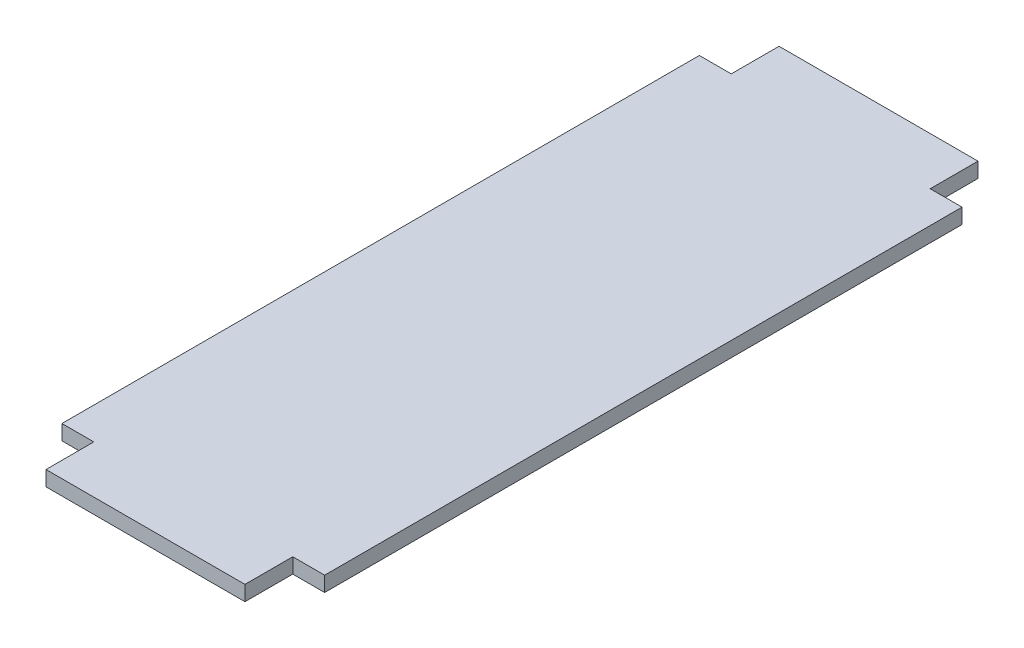
ISO-10303-21;
HEADER;
FILE_DESCRIPTION(('STEP AP214'),'2;1');
FILE_NAME('part.step','',(''),(''),'','','');
FILE_SCHEMA(('AUTOMOTIVE_DESIGN { 1 0 10303 214 1 1 1 1 }'));
ENDSEC;
DATA;
#1=APPLICATION_CONTEXT('core data for automotive mechanical design processes');
#2=APPLICATION_PROTOCOL_DEFINITION('international standard','automotive_design',2000,#1);
#3=PRODUCT_CONTEXT('',#1,'mechanical');
#4=PRODUCT('Part','Part','',(#3));
#5=PRODUCT_RELATED_PRODUCT_CATEGORY('part','',(#4));
#6=PRODUCT_DEFINITION_FORMATION('','',#4);
#7=PRODUCT_DEFINITION_CONTEXT('part definition',#1,'design');
#8=PRODUCT_DEFINITION('design','',#6,#7);
#9=PRODUCT_DEFINITION_SHAPE('','',#8);
#10=(LENGTH_UNIT() NAMED_UNIT(*) SI_UNIT(.MILLI.,.METRE.));
#11=(NAMED_UNIT(*) PLANE_ANGLE_UNIT() SI_UNIT($,.RADIAN.));
#12=(NAMED_UNIT(*) SI_UNIT($,.STERADIAN.) SOLID_ANGLE_UNIT());
#13=UNCERTAINTY_MEASURE_WITH_UNIT(LENGTH_MEASURE(1.E-05),#10,'distance_accuracy_value','');
#14=(GEOMETRIC_REPRESENTATION_CONTEXT(3) GLOBAL_UNCERTAINTY_ASSIGNED_CONTEXT((#13)) GLOBAL_UNIT_ASSIGNED_CONTEXT((#10,
#11,#12)) REPRESENTATION_CONTEXT('',''));
#15=CARTESIAN_POINT('',(0.,0.,0.));
#16=DIRECTION('',(0.,0.,1.));
#17=DIRECTION('',(1.,0.,0.));
#18=AXIS2_PLACEMENT_3D('',#15,#16,#17);
#19=CARTESIAN_POINT('',(0.,2.9972,73.025));
#20=DIRECTION('',(0.,0.,1.));
#21=DIRECTION('',(1.,0.,0.));
#22=AXIS2_PLACEMENT_3D('',#19,#20,#21);
#23=PLANE('',#22);
#24=DIRECTION('',(-1.,0.,0.));
#25=VECTOR('',#24,1.);
#26=CARTESIAN_POINT('',(0.,0.,73.025));
#27=LINE('',#26,#25);
#28=CARTESIAN_POINT('',(19.8190231000001,0.,73.025));
#29=VERTEX_POINT('',#28);
#30=CARTESIAN_POINT('',(-19.8190230999999,0.,73.025));
#31=VERTEX_POINT('',#30);
#32=EDGE_CURVE('E153',#29,#31,#27,.T.);
#33=ORIENTED_EDGE('',*,*,#32,.F.);
#34=DIRECTION('',(0.,-1.,0.));
#35=VECTOR('',#34,1.);
#36=CARTESIAN_POINT('',(19.8190231000001,2.9972,73.025));
#37=LINE('',#36,#35);
#38=CARTESIAN_POINT('',(19.8190231000001,2.9972,73.025));
#39=VERTEX_POINT('',#38);
#40=EDGE_CURVE('E11',#39,#29,#37,.T.);
#41=ORIENTED_EDGE('',*,*,#40,.F.);
#42=DIRECTION('',(-1.,0.,0.));
#43=VECTOR('',#42,1.);
#44=CARTESIAN_POINT('',(0.,2.9972,73.025));
#45=LINE('',#44,#43);
#46=CARTESIAN_POINT('',(-19.8190230999999,2.9972,73.025));
#47=VERTEX_POINT('',#46);
#48=EDGE_CURVE('E183',#39,#47,#45,.T.);
#49=ORIENTED_EDGE('',*,*,#48,.T.);
#50=DIRECTION('',(0.,-1.,0.));
#51=VECTOR('',#50,1.);
#52=CARTESIAN_POINT('',(-19.8190230999999,2.9972,73.025));
#53=LINE('',#52,#51);
#54=EDGE_CURVE('E50',#47,#31,#53,.T.);
#55=ORIENTED_EDGE('',*,*,#54,.T.);
#56=EDGE_LOOP('',(#33,#41,#49,#55));
#57=FACE_BOUND('',#56,.T.);
#58=ADVANCED_FACE('F34',(#57),#23,.T.);
#59=CARTESIAN_POINT('',(19.8190231000001,2.9972,0.));
#60=DIRECTION('',(-1.,0.,0.));
#61=DIRECTION('',(0.,0.,1.));
#62=AXIS2_PLACEMENT_3D('',#59,#60,#61);
#63=PLANE('',#62);
#64=DIRECTION('',(0.,0.,-1.));
#65=VECTOR('',#64,1.);
#66=CARTESIAN_POINT('',(19.8190231000001,0.,0.));
#67=LINE('',#66,#65);
#68=CARTESIAN_POINT('',(19.8190231000001,0.,63.5));
#69=VERTEX_POINT('',#68);
#70=EDGE_CURVE('E155',#29,#69,#67,.T.);
#71=ORIENTED_EDGE('',*,*,#70,.T.);
#72=DIRECTION('',(0.,-1.,0.));
#73=VECTOR('',#72,1.);
#74=CARTESIAN_POINT('',(19.8190231000001,2.9972,63.5));
#75=LINE('',#74,#73);
#76=CARTESIAN_POINT('',(19.8190231000001,2.9972,63.5));
#77=VERTEX_POINT('',#76);
#78=EDGE_CURVE('E42',#77,#69,#75,.T.);
#79=ORIENTED_EDGE('',*,*,#78,.F.);
#80=DIRECTION('',(0.,0.,-1.));
#81=VECTOR('',#80,1.);
#82=CARTESIAN_POINT('',(19.8190231000001,2.9972,0.));
#83=LINE('',#82,#81);
#84=EDGE_CURVE('E361',#39,#77,#83,.T.);
#85=ORIENTED_EDGE('',*,*,#84,.F.);
#86=ORIENTED_EDGE('',*,*,#40,.T.);
#87=EDGE_LOOP('',(#71,#79,#85,#86));
#88=FACE_BOUND('',#87,.T.);
#89=ADVANCED_FACE('F209',(#88),#63,.F.);
#90=CARTESIAN_POINT('',(0.,2.9972,63.5));
#91=DIRECTION('',(0.,0.,1.));
#92=DIRECTION('',(1.,0.,0.));
#93=AXIS2_PLACEMENT_3D('',#90,#91,#92);
#94=PLANE('',#93);
#95=DIRECTION('',(-1.,0.,0.));
#96=VECTOR('',#95,1.);
#97=CARTESIAN_POINT('',(0.,0.,63.5));
#98=LINE('',#97,#96);
#99=CARTESIAN_POINT('',(26.1690231000001,0.,63.5));
#100=VERTEX_POINT('',#99);
#101=EDGE_CURVE('E158',#100,#69,#98,.T.);
#102=ORIENTED_EDGE('',*,*,#101,.F.);
#103=DIRECTION('',(0.,-1.,0.));
#104=VECTOR('',#103,1.);
#105=CARTESIAN_POINT('',(26.1690231000001,2.9972,63.5));
#106=LINE('',#105,#104);
#107=CARTESIAN_POINT('',(26.1690231000001,2.9972,63.5));
#108=VERTEX_POINT('',#107);
#109=EDGE_CURVE('E199',#108,#100,#106,.T.);
#110=ORIENTED_EDGE('',*,*,#109,.F.);
#111=DIRECTION('',(-1.,0.,0.));
#112=VECTOR('',#111,1.);
#113=CARTESIAN_POINT('',(0.,2.9972,63.5));
#114=LINE('',#113,#112);
#115=EDGE_CURVE('E206',#108,#77,#114,.T.);
#116=ORIENTED_EDGE('',*,*,#115,.T.);
#117=ORIENTED_EDGE('',*,*,#78,.T.);
#118=EDGE_LOOP('',(#102,#110,#116,#117));
#119=FACE_BOUND('',#118,.T.);
#120=ADVANCED_FACE('F204',(#119),#94,.T.);
#121=CARTESIAN_POINT('',(26.1690231000001,2.9972,0.));
#122=DIRECTION('',(-1.,0.,0.));
#123=DIRECTION('',(0.,0.,1.));
#124=AXIS2_PLACEMENT_3D('',#121,#122,#123);
#125=PLANE('',#124);
#126=DIRECTION('',(0.,0.,-1.));
#127=VECTOR('',#126,1.);
#128=CARTESIAN_POINT('',(26.1690231000001,0.,0.));
#129=LINE('',#128,#127);
#130=CARTESIAN_POINT('',(26.1690231000001,0.,-63.5));
#131=VERTEX_POINT('',#130);
#132=EDGE_CURVE('E161',#100,#131,#129,.T.);
#133=ORIENTED_EDGE('',*,*,#132,.T.);
#134=DIRECTION('',(0.,-1.,0.));
#135=VECTOR('',#134,1.);
#136=CARTESIAN_POINT('',(26.1690231000001,2.9972,-63.5));
#137=LINE('',#136,#135);
#138=CARTESIAN_POINT('',(26.1690231000001,2.9972,-63.5));
#139=VERTEX_POINT('',#138);
#140=EDGE_CURVE('E196',#139,#131,#137,.T.);
#141=ORIENTED_EDGE('',*,*,#140,.F.);
#142=DIRECTION('',(0.,0.,-1.));
#143=VECTOR('',#142,1.);
#144=CARTESIAN_POINT('',(26.1690231000001,2.9972,0.));
#145=LINE('',#144,#143);
#146=EDGE_CURVE('E226',#108,#139,#145,.T.);
#147=ORIENTED_EDGE('',*,*,#146,.F.);
#148=ORIENTED_EDGE('',*,*,#109,.T.);
#149=EDGE_LOOP('',(#133,#141,#147,#148));
#150=FACE_BOUND('',#149,.T.);
#151=ADVANCED_FACE('F216',(#150),#125,.F.);
#152=CARTESIAN_POINT('',(0.,2.9972,-63.5));
#153=DIRECTION('',(0.,0.,1.));
#154=DIRECTION('',(1.,0.,0.));
#155=AXIS2_PLACEMENT_3D('',#152,#153,#154);
#156=PLANE('',#155);
#157=DIRECTION('',(-1.,0.,0.));
#158=VECTOR('',#157,1.);
#159=CARTESIAN_POINT('',(0.,0.,-63.5));
#160=LINE('',#159,#158);
#161=CARTESIAN_POINT('',(19.8190231000001,0.,-63.5));
#162=VERTEX_POINT('',#161);
#163=EDGE_CURVE('E163',#131,#162,#160,.T.);
#164=ORIENTED_EDGE('',*,*,#163,.T.);
#165=DIRECTION('',(0.,-1.,0.));
#166=VECTOR('',#165,1.);
#167=CARTESIAN_POINT('',(19.8190231000001,2.9972,-63.5));
#168=LINE('',#167,#166);
#169=CARTESIAN_POINT('',(19.8190231000001,2.9972,-63.5));
#170=VERTEX_POINT('',#169);
#171=EDGE_CURVE('E194',#170,#162,#168,.T.);
#172=ORIENTED_EDGE('',*,*,#171,.F.);
#173=DIRECTION('',(-1.,0.,0.));
#174=VECTOR('',#173,1.);
#175=CARTESIAN_POINT('',(0.,2.9972,-63.5));
#176=LINE('',#175,#174);
#177=EDGE_CURVE('E222',#139,#170,#176,.T.);
#178=ORIENTED_EDGE('',*,*,#177,.F.);
#179=ORIENTED_EDGE('',*,*,#140,.T.);
#180=EDGE_LOOP('',(#164,#172,#178,#179));
#181=FACE_BOUND('',#180,.T.);
#182=ADVANCED_FACE('F220',(#181),#156,.F.);
#183=CARTESIAN_POINT('',(19.8190231000001,2.9972,0.));
#184=DIRECTION('',(1.,0.,0.));
#185=DIRECTION('',(0.,0.,-1.));
#186=AXIS2_PLACEMENT_3D('',#183,#184,#185);
#187=PLANE('',#186);
#188=DIRECTION('',(0.,0.,1.));
#189=VECTOR('',#188,1.);
#190=CARTESIAN_POINT('',(19.8190231000001,0.,0.));
#191=LINE('',#190,#189);
#192=CARTESIAN_POINT('',(19.8190231000001,0.,-73.025));
#193=VERTEX_POINT('',#192);
#194=EDGE_CURVE('E166',#193,#162,#191,.T.);
#195=ORIENTED_EDGE('',*,*,#194,.F.);
#196=DIRECTION('',(0.,-1.,0.));
#197=VECTOR('',#196,1.);
#198=CARTESIAN_POINT('',(19.8190231000001,2.9972,-73.025));
#199=LINE('',#198,#197);
#200=CARTESIAN_POINT('',(19.8190231000001,2.9972,-73.025));
#201=VERTEX_POINT('',#200);
#202=EDGE_CURVE('E192',#201,#193,#199,.T.);
#203=ORIENTED_EDGE('',*,*,#202,.F.);
#204=DIRECTION('',(0.,0.,1.));
#205=VECTOR('',#204,1.);
#206=CARTESIAN_POINT('',(19.8190231000001,2.9972,0.));
#207=LINE('',#206,#205);
#208=EDGE_CURVE('E225',#201,#170,#207,.T.);
#209=ORIENTED_EDGE('',*,*,#208,.T.);
#210=ORIENTED_EDGE('',*,*,#171,.T.);
#211=EDGE_LOOP('',(#195,#203,#209,#210));
#212=FACE_BOUND('',#211,.T.);
#213=ADVANCED_FACE('F266',(#212),#187,.T.);
#214=CARTESIAN_POINT('',(0.,2.9972,-73.025));
#215=DIRECTION('',(0.,0.,1.));
#216=DIRECTION('',(1.,0.,0.));
#217=AXIS2_PLACEMENT_3D('',#214,#215,#216);
#218=PLANE('',#217);
#219=DIRECTION('',(-1.,0.,0.));
#220=VECTOR('',#219,1.);
#221=CARTESIAN_POINT('',(0.,0.,-73.025));
#222=LINE('',#221,#220);
#223=CARTESIAN_POINT('',(-19.8190230999999,0.,-73.025));
#224=VERTEX_POINT('',#223);
#225=EDGE_CURVE('E169',#193,#224,#222,.T.);
#226=ORIENTED_EDGE('',*,*,#225,.T.);
#227=DIRECTION('',(0.,-1.,0.));
#228=VECTOR('',#227,1.);
#229=CARTESIAN_POINT('',(-19.8190230999999,2.9972,-73.025));
#230=LINE('',#229,#228);
#231=CARTESIAN_POINT('',(-19.8190230999999,2.9972,-73.025));
#232=VERTEX_POINT('',#231);
#233=EDGE_CURVE('E189',#232,#224,#230,.T.);
#234=ORIENTED_EDGE('',*,*,#233,.F.);
#235=DIRECTION('',(-1.,0.,0.));
#236=VECTOR('',#235,1.);
#237=CARTESIAN_POINT('',(0.,2.9972,-73.025));
#238=LINE('',#237,#236);
#239=EDGE_CURVE('E228',#201,#232,#238,.T.);
#240=ORIENTED_EDGE('',*,*,#239,.F.);
#241=ORIENTED_EDGE('',*,*,#202,.T.);
#242=EDGE_LOOP('',(#226,#234,#240,#241));
#243=FACE_BOUND('',#242,.T.);
#244=ADVANCED_FACE('F269',(#243),#218,.F.);
#245=CARTESIAN_POINT('',(-19.8190230999999,2.9972,0.));
#246=DIRECTION('',(1.,0.,0.));
#247=DIRECTION('',(0.,0.,-1.));
#248=AXIS2_PLACEMENT_3D('',#245,#246,#247);
#249=PLANE('',#248);
#250=DIRECTION('',(0.,0.,1.));
#251=VECTOR('',#250,1.);
#252=CARTESIAN_POINT('',(-19.8190230999999,0.,0.));
#253=LINE('',#252,#251);
#254=CARTESIAN_POINT('',(-19.8190230999999,0.,-63.5));
#255=VERTEX_POINT('',#254);
#256=EDGE_CURVE('E171',#224,#255,#253,.T.);
#257=ORIENTED_EDGE('',*,*,#256,.T.);
#258=DIRECTION('',(0.,-1.,0.));
#259=VECTOR('',#258,1.);
#260=CARTESIAN_POINT('',(-19.8190230999999,2.9972,-63.5));
#261=LINE('',#260,#259);
#262=CARTESIAN_POINT('',(-19.8190230999999,2.9972,-63.5));
#263=VERTEX_POINT('',#262);
#264=EDGE_CURVE('E187',#263,#255,#261,.T.);
#265=ORIENTED_EDGE('',*,*,#264,.F.);
#266=DIRECTION('',(0.,0.,1.));
#267=VECTOR('',#266,1.);
#268=CARTESIAN_POINT('',(-19.8190230999999,2.9972,0.));
#269=LINE('',#268,#267);
#270=EDGE_CURVE('E148',#232,#263,#269,.T.);
#271=ORIENTED_EDGE('',*,*,#270,.F.);
#272=ORIENTED_EDGE('',*,*,#233,.T.);
#273=EDGE_LOOP('',(#257,#265,#271,#272));
#274=FACE_BOUND('',#273,.T.);
#275=ADVANCED_FACE('F238',(#274),#249,.F.);
#276=CARTESIAN_POINT('',(1.38777878078145E-13,2.9972,-63.5));
#277=DIRECTION('',(0.,0.,-1.));
#278=DIRECTION('',(-1.,0.,0.));
#279=AXIS2_PLACEMENT_3D('',#276,#277,#278);
#280=PLANE('',#279);
#281=DIRECTION('',(1.,0.,0.));
#282=VECTOR('',#281,1.);
#283=CARTESIAN_POINT('',(1.38777878078145E-13,0.,-63.5));
#284=LINE('',#283,#282);
#285=CARTESIAN_POINT('',(-26.1690230999999,0.,-63.5));
#286=VERTEX_POINT('',#285);
#287=EDGE_CURVE('E174',#286,#255,#284,.T.);
#288=ORIENTED_EDGE('',*,*,#287,.F.);
#289=DIRECTION('',(0.,-1.,0.));
#290=VECTOR('',#289,1.);
#291=CARTESIAN_POINT('',(-26.1690230999999,2.9972,-63.5));
#292=LINE('',#291,#290);
#293=CARTESIAN_POINT('',(-26.1690230999999,2.9972,-63.5));
#294=VERTEX_POINT('',#293);
#295=EDGE_CURVE('E134',#294,#286,#292,.T.);
#296=ORIENTED_EDGE('',*,*,#295,.F.);
#297=DIRECTION('',(1.,0.,0.));
#298=VECTOR('',#297,1.);
#299=CARTESIAN_POINT('',(1.38777878078145E-13,2.9972,-63.5));
#300=LINE('',#299,#298);
#301=EDGE_CURVE('E146',#294,#263,#300,.T.);
#302=ORIENTED_EDGE('',*,*,#301,.T.);
#303=ORIENTED_EDGE('',*,*,#264,.T.);
#304=EDGE_LOOP('',(#288,#296,#302,#303));
#305=FACE_BOUND('',#304,.T.);
#306=ADVANCED_FACE('F242',(#305),#280,.T.);
#307=CARTESIAN_POINT('',(-26.1690230999999,2.9972,0.));
#308=DIRECTION('',(-1.,0.,0.));
#309=DIRECTION('',(0.,0.,1.));
#310=AXIS2_PLACEMENT_3D('',#307,#308,#309);
#311=PLANE('',#310);
#312=DIRECTION('',(0.,0.,-1.));
#313=VECTOR('',#312,1.);
#314=CARTESIAN_POINT('',(-26.1690230999999,0.,0.));
#315=LINE('',#314,#313);
#316=CARTESIAN_POINT('',(-26.1690230999999,0.,63.5));
#317=VERTEX_POINT('',#316);
#318=EDGE_CURVE('E131',#317,#286,#315,.T.);
#319=ORIENTED_EDGE('',*,*,#318,.F.);
#320=DIRECTION('',(0.,-1.,0.));
#321=VECTOR('',#320,1.);
#322=CARTESIAN_POINT('',(-26.1690230999999,2.9972,63.5));
#323=LINE('',#322,#321);
#324=CARTESIAN_POINT('',(-26.1690230999999,2.9972,63.5));
#325=VERTEX_POINT('',#324);
#326=EDGE_CURVE('E125',#325,#317,#323,.T.);
#327=ORIENTED_EDGE('',*,*,#326,.F.);
#328=DIRECTION('',(0.,0.,-1.));
#329=VECTOR('',#328,1.);
#330=CARTESIAN_POINT('',(-26.1690230999999,2.9972,0.));
#331=LINE('',#330,#329);
#332=EDGE_CURVE('E129',#325,#294,#331,.T.);
#333=ORIENTED_EDGE('',*,*,#332,.T.);
#334=ORIENTED_EDGE('',*,*,#295,.T.);
#335=EDGE_LOOP('',(#319,#327,#333,#334));
#336=FACE_BOUND('',#335,.T.);
#337=ADVANCED_FACE('F127',(#336),#311,.T.);
#338=CARTESIAN_POINT('',(1.38777878078145E-13,2.9972,63.5));
#339=DIRECTION('',(0.,0.,-1.));
#340=DIRECTION('',(-1.,0.,0.));
#341=AXIS2_PLACEMENT_3D('',#338,#339,#340);
#342=PLANE('',#341);
#343=DIRECTION('',(1.,0.,0.));
#344=VECTOR('',#343,1.);
#345=CARTESIAN_POINT('',(1.38777878078145E-13,0.,63.5));
#346=LINE('',#345,#344);
#347=CARTESIAN_POINT('',(-19.8190230999999,0.,63.5));
#348=VERTEX_POINT('',#347);
#349=EDGE_CURVE('E178',#317,#348,#346,.T.);
#350=ORIENTED_EDGE('',*,*,#349,.T.);
#351=DIRECTION('',(0.,-1.,0.));
#352=VECTOR('',#351,1.);
#353=CARTESIAN_POINT('',(-19.8190230999999,2.9972,63.5));
#354=LINE('',#353,#352);
#355=CARTESIAN_POINT('',(-19.8190230999999,2.9972,63.5));
#356=VERTEX_POINT('',#355);
#357=EDGE_CURVE('E88',#356,#348,#354,.T.);
#358=ORIENTED_EDGE('',*,*,#357,.F.);
#359=DIRECTION('',(1.,0.,0.));
#360=VECTOR('',#359,1.);
#361=CARTESIAN_POINT('',(1.38777878078145E-13,2.9972,63.5));
#362=LINE('',#361,#360);
#363=EDGE_CURVE('E136',#325,#356,#362,.T.);
#364=ORIENTED_EDGE('',*,*,#363,.F.);
#365=ORIENTED_EDGE('',*,*,#326,.T.);
#366=EDGE_LOOP('',(#350,#358,#364,#365));
#367=FACE_BOUND('',#366,.T.);
#368=ADVANCED_FACE('F137',(#367),#342,.F.);
#369=CARTESIAN_POINT('',(-19.8190230999999,2.9972,0.));
#370=DIRECTION('',(-1.,0.,0.));
#371=DIRECTION('',(0.,0.,1.));
#372=AXIS2_PLACEMENT_3D('',#369,#370,#371);
#373=PLANE('',#372);
#374=DIRECTION('',(0.,0.,-1.));
#375=VECTOR('',#374,1.);
#376=CARTESIAN_POINT('',(-19.8190230999999,0.,0.));
#377=LINE('',#376,#375);
#378=EDGE_CURVE('E180',#31,#348,#377,.T.);
#379=ORIENTED_EDGE('',*,*,#378,.F.);
#380=ORIENTED_EDGE('',*,*,#54,.F.);
#381=DIRECTION('',(0.,0.,-1.));
#382=VECTOR('',#381,1.);
#383=CARTESIAN_POINT('',(-19.8190230999999,2.9972,0.));
#384=LINE('',#383,#382);
#385=EDGE_CURVE('E140',#47,#356,#384,.T.);
#386=ORIENTED_EDGE('',*,*,#385,.T.);
#387=ORIENTED_EDGE('',*,*,#357,.T.);
#388=EDGE_LOOP('',(#379,#380,#386,#387));
#389=FACE_BOUND('',#388,.T.);
#390=ADVANCED_FACE('F243',(#389),#373,.T.);
#391=CARTESIAN_POINT('',(0.,2.9972,0.));
#392=DIRECTION('',(0.,1.,0.));
#393=DIRECTION('',(0.,0.,1.));
#394=AXIS2_PLACEMENT_3D('',#391,#392,#393);
#395=PLANE('',#394);
#396=ORIENTED_EDGE('',*,*,#48,.F.);
#397=ORIENTED_EDGE('',*,*,#84,.T.);
#398=ORIENTED_EDGE('',*,*,#115,.F.);
#399=ORIENTED_EDGE('',*,*,#146,.T.);
#400=ORIENTED_EDGE('',*,*,#177,.T.);
#401=ORIENTED_EDGE('',*,*,#208,.F.);
#402=ORIENTED_EDGE('',*,*,#239,.T.);
#403=ORIENTED_EDGE('',*,*,#270,.T.);
#404=ORIENTED_EDGE('',*,*,#301,.F.);
#405=ORIENTED_EDGE('',*,*,#332,.F.);
#406=ORIENTED_EDGE('',*,*,#363,.T.);
#407=ORIENTED_EDGE('',*,*,#385,.F.);
#408=EDGE_LOOP('',(#396,#397,#398,#399,#400,#401,#402,#403,#404,#405,#406,#407));
#409=FACE_BOUND('',#408,.T.);
#410=ADVANCED_FACE('F144',(#409),#395,.T.);
#411=CARTESIAN_POINT('',(0.,0.,0.));
#412=DIRECTION('',(0.,1.,0.));
#413=DIRECTION('',(0.,0.,1.));
#414=AXIS2_PLACEMENT_3D('',#411,#412,#413);
#415=PLANE('',#414);
#416=ORIENTED_EDGE('',*,*,#32,.T.);
#417=ORIENTED_EDGE('',*,*,#378,.T.);
#418=ORIENTED_EDGE('',*,*,#349,.F.);
#419=ORIENTED_EDGE('',*,*,#318,.T.);
#420=ORIENTED_EDGE('',*,*,#287,.T.);
#421=ORIENTED_EDGE('',*,*,#256,.F.);
#422=ORIENTED_EDGE('',*,*,#225,.F.);
#423=ORIENTED_EDGE('',*,*,#194,.T.);
#424=ORIENTED_EDGE('',*,*,#163,.F.);
#425=ORIENTED_EDGE('',*,*,#132,.F.);
#426=ORIENTED_EDGE('',*,*,#101,.T.);
#427=ORIENTED_EDGE('',*,*,#70,.F.);
#428=EDGE_LOOP('',(#416,#417,#418,#419,#420,#421,#422,#423,#424,#425,#426,#427));
#429=FACE_BOUND('',#428,.T.);
#430=ADVANCED_FACE('F212',(#429),#415,.F.);
#431=CLOSED_SHELL('',(#58,#89,#120,#151,#182,#213,#244,#275,#306,#337,#368,#390,#410,#430));
#432=MANIFOLD_SOLID_BREP('B2',#431);
#433=ADVANCED_BREP_SHAPE_REPRESENTATION('',(#18,#432),#14);
#434=SHAPE_DEFINITION_REPRESENTATION(#9,#433);
ENDSEC;
END-ISO-10303-21;
